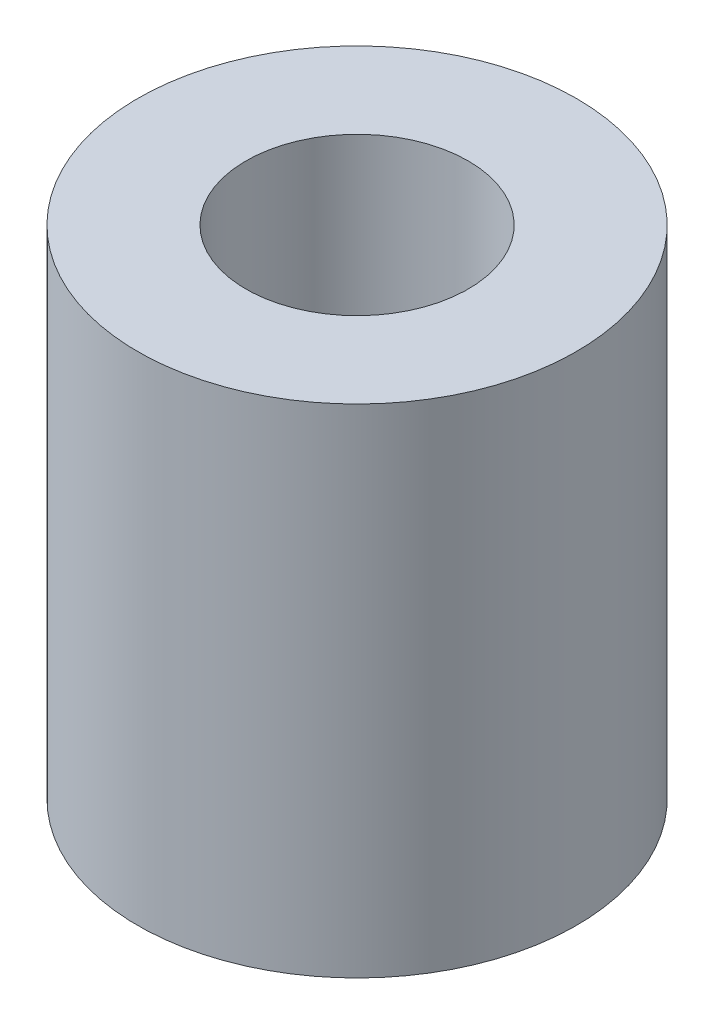
ISO-10303-21;
HEADER;
FILE_DESCRIPTION(('STEP AP214'),'2;1');
FILE_NAME('part.step','',(''),(''),'','','');
FILE_SCHEMA(('AUTOMOTIVE_DESIGN { 1 0 10303 214 1 1 1 1 }'));
ENDSEC;
DATA;
#1=APPLICATION_CONTEXT('core data for automotive mechanical design processes');
#2=APPLICATION_PROTOCOL_DEFINITION('international standard','automotive_design',2000,#1);
#3=PRODUCT_CONTEXT('',#1,'mechanical');
#4=PRODUCT('Part','Part','',(#3));
#5=PRODUCT_RELATED_PRODUCT_CATEGORY('part','',(#4));
#6=PRODUCT_DEFINITION_FORMATION('','',#4);
#7=PRODUCT_DEFINITION_CONTEXT('part definition',#1,'design');
#8=PRODUCT_DEFINITION('design','',#6,#7);
#9=PRODUCT_DEFINITION_SHAPE('','',#8);
#10=(LENGTH_UNIT() NAMED_UNIT(*) SI_UNIT(.MILLI.,.METRE.));
#11=(NAMED_UNIT(*) PLANE_ANGLE_UNIT() SI_UNIT($,.RADIAN.));
#12=(NAMED_UNIT(*) SI_UNIT($,.STERADIAN.) SOLID_ANGLE_UNIT());
#13=UNCERTAINTY_MEASURE_WITH_UNIT(LENGTH_MEASURE(1.E-05),#10,'distance_accuracy_value','');
#14=(GEOMETRIC_REPRESENTATION_CONTEXT(3) GLOBAL_UNCERTAINTY_ASSIGNED_CONTEXT((#13)) GLOBAL_UNIT_ASSIGNED_CONTEXT((#10,
#11,#12)) REPRESENTATION_CONTEXT('',''));
#15=CARTESIAN_POINT('',(0.,0.,0.));
#16=DIRECTION('',(0.,0.,1.));
#17=DIRECTION('',(1.,0.,0.));
#18=AXIS2_PLACEMENT_3D('',#15,#16,#17);
#19=CARTESIAN_POINT('',(0.,0.,0.));
#20=DIRECTION('',(0.,1.,0.));
#21=DIRECTION('',(0.,0.,1.));
#22=AXIS2_PLACEMENT_3D('',#19,#20,#21);
#23=CYLINDRICAL_SURFACE('',#22,9.525);
#24=CARTESIAN_POINT('',(0.,0.,0.));
#25=DIRECTION('',(0.,1.,0.));
#26=DIRECTION('',(0.,0.,-1.));
#27=AXIS2_PLACEMENT_3D('',#24,#25,#26);
#28=CIRCLE('',#27,9.525);
#29=CARTESIAN_POINT('',(0.,0.,-9.525));
#30=VERTEX_POINT('',#29);
#31=EDGE_CURVE('E10',#30,#30,#28,.T.);
#32=ORIENTED_EDGE('',*,*,#31,.T.);
#33=EDGE_LOOP('',(#32));
#34=FACE_BOUND('',#33,.T.);
#35=CARTESIAN_POINT('',(0.,21.59,0.));
#36=DIRECTION('',(0.,1.,0.));
#37=DIRECTION('',(0.,0.,-1.));
#38=AXIS2_PLACEMENT_3D('',#35,#36,#37);
#39=CIRCLE('',#38,9.525);
#40=CARTESIAN_POINT('',(0.,21.59,-9.525));
#41=VERTEX_POINT('',#40);
#42=EDGE_CURVE('E33',#41,#41,#39,.T.);
#43=ORIENTED_EDGE('',*,*,#42,.F.);
#44=EDGE_LOOP('',(#43));
#45=FACE_BOUND('',#44,.T.);
#46=ADVANCED_FACE('F30',(#34,#45),#23,.T.);
#47=CARTESIAN_POINT('',(0.,0.,0.));
#48=DIRECTION('',(0.,-1.,0.));
#49=DIRECTION('',(0.,0.,-1.));
#50=AXIS2_PLACEMENT_3D('',#47,#48,#49);
#51=PLANE('',#50);
#52=CARTESIAN_POINT('',(0.,0.,0.));
#53=DIRECTION('',(0.,1.,0.));
#54=DIRECTION('',(0.,0.,-1.));
#55=AXIS2_PLACEMENT_3D('',#52,#53,#54);
#56=CIRCLE('',#55,4.826);
#57=CARTESIAN_POINT('',(0.,0.,-4.826));
#58=VERTEX_POINT('',#57);
#59=EDGE_CURVE('E40',#58,#58,#56,.T.);
#60=ORIENTED_EDGE('',*,*,#59,.T.);
#61=EDGE_LOOP('',(#60));
#62=FACE_BOUND('',#61,.T.);
#63=ORIENTED_EDGE('',*,*,#31,.F.);
#64=EDGE_LOOP('',(#63));
#65=FACE_BOUND('',#64,.T.);
#66=ADVANCED_FACE('F48',(#62,#65),#51,.T.);
#67=CARTESIAN_POINT('',(0.,21.59,0.));
#68=DIRECTION('',(0.,-1.,0.));
#69=DIRECTION('',(0.,0.,-1.));
#70=AXIS2_PLACEMENT_3D('',#67,#68,#69);
#71=PLANE('',#70);
#72=CARTESIAN_POINT('',(0.,21.59,0.));
#73=DIRECTION('',(0.,1.,0.));
#74=DIRECTION('',(0.,0.,-1.));
#75=AXIS2_PLACEMENT_3D('',#72,#73,#74);
#76=CIRCLE('',#75,4.826);
#77=CARTESIAN_POINT('',(0.,21.59,-4.826));
#78=VERTEX_POINT('',#77);
#79=EDGE_CURVE('E42',#78,#78,#76,.T.);
#80=ORIENTED_EDGE('',*,*,#79,.F.);
#81=EDGE_LOOP('',(#80));
#82=FACE_BOUND('',#81,.T.);
#83=ORIENTED_EDGE('',*,*,#42,.T.);
#84=EDGE_LOOP('',(#83));
#85=FACE_BOUND('',#84,.T.);
#86=ADVANCED_FACE('F54',(#82,#85),#71,.F.);
#87=CARTESIAN_POINT('',(0.,0.,0.));
#88=DIRECTION('',(0.,1.,0.));
#89=DIRECTION('',(0.,0.,1.));
#90=AXIS2_PLACEMENT_3D('',#87,#88,#89);
#91=CYLINDRICAL_SURFACE('',#90,4.826);
#92=ORIENTED_EDGE('',*,*,#59,.F.);
#93=EDGE_LOOP('',(#92));
#94=FACE_BOUND('',#93,.T.);
#95=ORIENTED_EDGE('',*,*,#79,.T.);
#96=EDGE_LOOP('',(#95));
#97=FACE_BOUND('',#96,.T.);
#98=ADVANCED_FACE('F51',(#94,#97),#91,.F.);
#99=CLOSED_SHELL('',(#46,#66,#86,#98));
#100=MANIFOLD_SOLID_BREP('B2',#99);
#101=ADVANCED_BREP_SHAPE_REPRESENTATION('',(#18,#100),#14);
#102=SHAPE_DEFINITION_REPRESENTATION(#9,#101);
ENDSEC;
END-ISO-10303-21;
